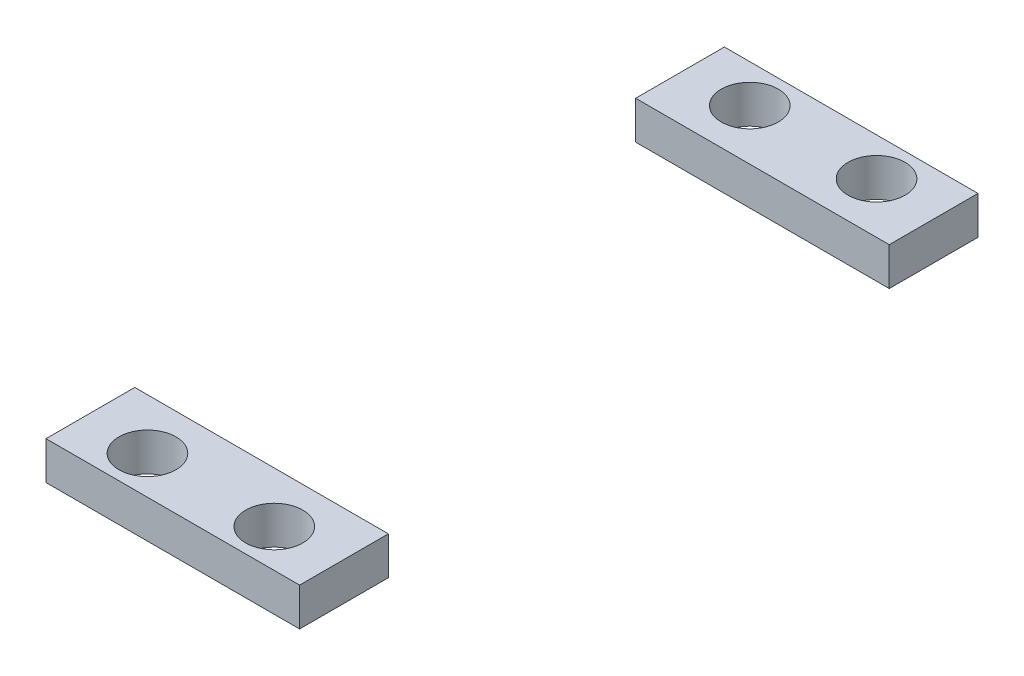
ISO-10303-21;
HEADER;
FILE_DESCRIPTION(('STEP AP214'),'2;1');
FILE_NAME('part.step','',(''),(''),'','','');
FILE_SCHEMA(('AUTOMOTIVE_DESIGN { 1 0 10303 214 1 1 1 1 }'));
ENDSEC;
DATA;
#1=APPLICATION_CONTEXT('core data for automotive mechanical design processes');
#2=APPLICATION_PROTOCOL_DEFINITION('international standard','automotive_design',2000,#1);
#3=PRODUCT_CONTEXT('',#1,'mechanical');
#4=PRODUCT('Part','Part','',(#3));
#5=PRODUCT_RELATED_PRODUCT_CATEGORY('part','',(#4));
#6=PRODUCT_DEFINITION_FORMATION('','',#4);
#7=PRODUCT_DEFINITION_CONTEXT('part definition',#1,'design');
#8=PRODUCT_DEFINITION('design','',#6,#7);
#9=PRODUCT_DEFINITION_SHAPE('','',#8);
#10=(LENGTH_UNIT() NAMED_UNIT(*) SI_UNIT(.MILLI.,.METRE.));
#11=(NAMED_UNIT(*) PLANE_ANGLE_UNIT() SI_UNIT($,.RADIAN.));
#12=(NAMED_UNIT(*) SI_UNIT($,.STERADIAN.) SOLID_ANGLE_UNIT());
#13=UNCERTAINTY_MEASURE_WITH_UNIT(LENGTH_MEASURE(1.E-05),#10,'distance_accuracy_value','');
#14=(GEOMETRIC_REPRESENTATION_CONTEXT(3) GLOBAL_UNCERTAINTY_ASSIGNED_CONTEXT((#13)) GLOBAL_UNIT_ASSIGNED_CONTEXT((#10,
#11,#12)) REPRESENTATION_CONTEXT('',''));
#15=CARTESIAN_POINT('',(0.,0.,0.));
#16=DIRECTION('',(0.,0.,1.));
#17=DIRECTION('',(1.,0.,0.));
#18=AXIS2_PLACEMENT_3D('',#15,#16,#17);
#19=CARTESIAN_POINT('',(0.,3.,-46.5));
#20=DIRECTION('',(0.,0.,-1.));
#21=DIRECTION('',(-1.,0.,0.));
#22=AXIS2_PLACEMENT_3D('',#19,#20,#21);
#23=PLANE('',#22);
#24=DIRECTION('',(1.,0.,0.));
#25=VECTOR('',#24,1.);
#26=CARTESIAN_POINT('',(0.,0.,-46.5));
#27=LINE('',#26,#25);
#28=CARTESIAN_POINT('',(0.,0.,-46.5));
#29=VERTEX_POINT('',#28);
#30=CARTESIAN_POINT('',(20.,0.,-46.5));
#31=VERTEX_POINT('',#30);
#32=EDGE_CURVE('E130',#29,#31,#27,.T.);
#33=ORIENTED_EDGE('',*,*,#32,.T.);
#34=DIRECTION('',(0.,-1.,0.));
#35=VECTOR('',#34,1.);
#36=CARTESIAN_POINT('',(20.,3.,-46.5));
#37=LINE('',#36,#35);
#38=CARTESIAN_POINT('',(20.,3.,-46.5));
#39=VERTEX_POINT('',#38);
#40=EDGE_CURVE('E14',#39,#31,#37,.T.);
#41=ORIENTED_EDGE('',*,*,#40,.F.);
#42=DIRECTION('',(1.,0.,0.));
#43=VECTOR('',#42,1.);
#44=CARTESIAN_POINT('',(0.,3.,-46.5));
#45=LINE('',#44,#43);
#46=CARTESIAN_POINT('',(0.,3.,-46.5));
#47=VERTEX_POINT('',#46);
#48=EDGE_CURVE('E110',#47,#39,#45,.T.);
#49=ORIENTED_EDGE('',*,*,#48,.F.);
#50=DIRECTION('',(0.,-1.,0.));
#51=VECTOR('',#50,1.);
#52=CARTESIAN_POINT('',(0.,3.,-46.5));
#53=LINE('',#52,#51);
#54=EDGE_CURVE('E77',#47,#29,#53,.T.);
#55=ORIENTED_EDGE('',*,*,#54,.T.);
#56=EDGE_LOOP('',(#33,#41,#49,#55));
#57=FACE_BOUND('',#56,.T.);
#58=ADVANCED_FACE('F60',(#57),#23,.F.);
#59=CARTESIAN_POINT('',(20.,3.,0.));
#60=DIRECTION('',(-1.,0.,0.));
#61=DIRECTION('',(0.,0.,1.));
#62=AXIS2_PLACEMENT_3D('',#59,#60,#61);
#63=PLANE('',#62);
#64=DIRECTION('',(0.,0.,-1.));
#65=VECTOR('',#64,1.);
#66=CARTESIAN_POINT('',(20.,0.,0.));
#67=LINE('',#66,#65);
#68=CARTESIAN_POINT('',(20.,0.,-53.5));
#69=VERTEX_POINT('',#68);
#70=EDGE_CURVE('E115',#31,#69,#67,.T.);
#71=ORIENTED_EDGE('',*,*,#70,.T.);
#72=DIRECTION('',(0.,-1.,0.));
#73=VECTOR('',#72,1.);
#74=CARTESIAN_POINT('',(20.,3.,-53.5));
#75=LINE('',#74,#73);
#76=CARTESIAN_POINT('',(20.,3.,-53.5));
#77=VERTEX_POINT('',#76);
#78=EDGE_CURVE('E69',#77,#69,#75,.T.);
#79=ORIENTED_EDGE('',*,*,#78,.F.);
#80=DIRECTION('',(0.,0.,-1.));
#81=VECTOR('',#80,1.);
#82=CARTESIAN_POINT('',(20.,3.,0.));
#83=LINE('',#82,#81);
#84=EDGE_CURVE('E102',#39,#77,#83,.T.);
#85=ORIENTED_EDGE('',*,*,#84,.F.);
#86=ORIENTED_EDGE('',*,*,#40,.T.);
#87=EDGE_LOOP('',(#71,#79,#85,#86));
#88=FACE_BOUND('',#87,.T.);
#89=ADVANCED_FACE('F114',(#88),#63,.F.);
#90=CARTESIAN_POINT('',(0.,3.,-53.5));
#91=DIRECTION('',(0.,0.,-1.));
#92=DIRECTION('',(-1.,0.,0.));
#93=AXIS2_PLACEMENT_3D('',#90,#91,#92);
#94=PLANE('',#93);
#95=DIRECTION('',(1.,0.,0.));
#96=VECTOR('',#95,1.);
#97=CARTESIAN_POINT('',(0.,0.,-53.5));
#98=LINE('',#97,#96);
#99=CARTESIAN_POINT('',(0.,0.,-53.5));
#100=VERTEX_POINT('',#99);
#101=EDGE_CURVE('E133',#100,#69,#98,.T.);
#102=ORIENTED_EDGE('',*,*,#101,.F.);
#103=DIRECTION('',(0.,-1.,0.));
#104=VECTOR('',#103,1.);
#105=CARTESIAN_POINT('',(0.,3.,-53.5));
#106=LINE('',#105,#104);
#107=CARTESIAN_POINT('',(0.,3.,-53.5));
#108=VERTEX_POINT('',#107);
#109=EDGE_CURVE('E91',#108,#100,#106,.T.);
#110=ORIENTED_EDGE('',*,*,#109,.F.);
#111=DIRECTION('',(1.,0.,0.));
#112=VECTOR('',#111,1.);
#113=CARTESIAN_POINT('',(0.,3.,-53.5));
#114=LINE('',#113,#112);
#115=EDGE_CURVE('E109',#108,#77,#114,.T.);
#116=ORIENTED_EDGE('',*,*,#115,.T.);
#117=ORIENTED_EDGE('',*,*,#78,.T.);
#118=EDGE_LOOP('',(#102,#110,#116,#117));
#119=FACE_BOUND('',#118,.T.);
#120=ADVANCED_FACE('F118',(#119),#94,.T.);
#121=CARTESIAN_POINT('',(15.,3.,-50.5));
#122=DIRECTION('',(0.,-1.,0.));
#123=DIRECTION('',(0.,0.,-1.));
#124=AXIS2_PLACEMENT_3D('',#121,#122,#123);
#125=CYLINDRICAL_SURFACE('',#124,2.25);
#126=CARTESIAN_POINT('',(15.,3.,-50.5));
#127=DIRECTION('',(0.,1.,0.));
#128=DIRECTION('',(0.,0.,1.));
#129=AXIS2_PLACEMENT_3D('',#126,#127,#128);
#130=CIRCLE('',#129,2.25);
#131=CARTESIAN_POINT('',(15.,3.,-48.25));
#132=VERTEX_POINT('',#131);
#133=EDGE_CURVE('E142',#132,#132,#130,.T.);
#134=ORIENTED_EDGE('',*,*,#133,.T.);
#135=EDGE_LOOP('',(#134));
#136=FACE_BOUND('',#135,.T.);
#137=CARTESIAN_POINT('',(15.,0.,-50.5));
#138=DIRECTION('',(0.,1.,0.));
#139=DIRECTION('',(0.,0.,1.));
#140=AXIS2_PLACEMENT_3D('',#137,#138,#139);
#141=CIRCLE('',#140,2.25);
#142=CARTESIAN_POINT('',(15.,0.,-48.25));
#143=VERTEX_POINT('',#142);
#144=EDGE_CURVE('E127',#143,#143,#141,.T.);
#145=ORIENTED_EDGE('',*,*,#144,.F.);
#146=EDGE_LOOP('',(#145));
#147=FACE_BOUND('',#146,.T.);
#148=ADVANCED_FACE('F150',(#136,#147),#125,.F.);
#149=CARTESIAN_POINT('',(5.,3.,-50.5));
#150=DIRECTION('',(0.,-1.,0.));
#151=DIRECTION('',(0.,0.,-1.));
#152=AXIS2_PLACEMENT_3D('',#149,#150,#151);
#153=CYLINDRICAL_SURFACE('',#152,2.25);
#154=CARTESIAN_POINT('',(5.,3.,-50.5));
#155=DIRECTION('',(0.,1.,0.));
#156=DIRECTION('',(0.,0.,1.));
#157=AXIS2_PLACEMENT_3D('',#154,#155,#156);
#158=CIRCLE('',#157,2.25);
#159=CARTESIAN_POINT('',(5.,3.,-48.25));
#160=VERTEX_POINT('',#159);
#161=EDGE_CURVE('E138',#160,#160,#158,.T.);
#162=ORIENTED_EDGE('',*,*,#161,.T.);
#163=EDGE_LOOP('',(#162));
#164=FACE_BOUND('',#163,.T.);
#165=CARTESIAN_POINT('',(5.,0.,-50.5));
#166=DIRECTION('',(0.,1.,0.));
#167=DIRECTION('',(0.,0.,1.));
#168=AXIS2_PLACEMENT_3D('',#165,#166,#167);
#169=CIRCLE('',#168,2.25);
#170=CARTESIAN_POINT('',(5.,0.,-48.25));
#171=VERTEX_POINT('',#170);
#172=EDGE_CURVE('E124',#171,#171,#169,.T.);
#173=ORIENTED_EDGE('',*,*,#172,.F.);
#174=EDGE_LOOP('',(#173));
#175=FACE_BOUND('',#174,.T.);
#176=ADVANCED_FACE('F62',(#164,#175),#153,.F.);
#177=CARTESIAN_POINT('',(0.,3.,0.));
#178=DIRECTION('',(-1.,0.,0.));
#179=DIRECTION('',(0.,0.,1.));
#180=AXIS2_PLACEMENT_3D('',#177,#178,#179);
#181=PLANE('',#180);
#182=DIRECTION('',(0.,0.,-1.));
#183=VECTOR('',#182,1.);
#184=CARTESIAN_POINT('',(0.,0.,0.));
#185=LINE('',#184,#183);
#186=EDGE_CURVE('E135',#29,#100,#185,.T.);
#187=ORIENTED_EDGE('',*,*,#186,.F.);
#188=ORIENTED_EDGE('',*,*,#54,.F.);
#189=DIRECTION('',(0.,0.,-1.));
#190=VECTOR('',#189,1.);
#191=CARTESIAN_POINT('',(0.,3.,0.));
#192=LINE('',#191,#190);
#193=EDGE_CURVE('E119',#47,#108,#192,.T.);
#194=ORIENTED_EDGE('',*,*,#193,.T.);
#195=ORIENTED_EDGE('',*,*,#109,.T.);
#196=EDGE_LOOP('',(#187,#188,#194,#195));
#197=FACE_BOUND('',#196,.T.);
#198=ADVANCED_FACE('F155',(#197),#181,.T.);
#199=CARTESIAN_POINT('',(0.,3.,0.));
#200=DIRECTION('',(0.,1.,0.));
#201=DIRECTION('',(0.,0.,1.));
#202=AXIS2_PLACEMENT_3D('',#199,#200,#201);
#203=PLANE('',#202);
#204=ORIENTED_EDGE('',*,*,#161,.F.);
#205=EDGE_LOOP('',(#204));
#206=FACE_BOUND('',#205,.T.);
#207=ORIENTED_EDGE('',*,*,#133,.F.);
#208=EDGE_LOOP('',(#207));
#209=FACE_BOUND('',#208,.T.);
#210=ORIENTED_EDGE('',*,*,#48,.T.);
#211=ORIENTED_EDGE('',*,*,#84,.T.);
#212=ORIENTED_EDGE('',*,*,#115,.F.);
#213=ORIENTED_EDGE('',*,*,#193,.F.);
#214=EDGE_LOOP('',(#210,#211,#212,#213));
#215=FACE_BOUND('',#214,.T.);
#216=ADVANCED_FACE('F106',(#206,#209,#215),#203,.T.);
#217=CARTESIAN_POINT('',(0.,0.,0.));
#218=DIRECTION('',(0.,1.,0.));
#219=DIRECTION('',(0.,0.,1.));
#220=AXIS2_PLACEMENT_3D('',#217,#218,#219);
#221=PLANE('',#220);
#222=ORIENTED_EDGE('',*,*,#172,.T.);
#223=EDGE_LOOP('',(#222));
#224=FACE_BOUND('',#223,.T.);
#225=ORIENTED_EDGE('',*,*,#144,.T.);
#226=EDGE_LOOP('',(#225));
#227=FACE_BOUND('',#226,.T.);
#228=ORIENTED_EDGE('',*,*,#32,.F.);
#229=ORIENTED_EDGE('',*,*,#186,.T.);
#230=ORIENTED_EDGE('',*,*,#101,.T.);
#231=ORIENTED_EDGE('',*,*,#70,.F.);
#232=EDGE_LOOP('',(#228,#229,#230,#231));
#233=FACE_BOUND('',#232,.T.);
#234=ADVANCED_FACE('F154',(#224,#227,#233),#221,.F.);
#235=CLOSED_SHELL('',(#58,#89,#120,#148,#176,#198,#216,#234));
#236=MANIFOLD_SOLID_BREP('B2',#235);
#237=CARTESIAN_POINT('',(0.,3.,-7.));
#238=DIRECTION('',(0.,0.,-1.));
#239=DIRECTION('',(-1.,0.,0.));
#240=AXIS2_PLACEMENT_3D('',#237,#238,#239);
#241=PLANE('',#240);
#242=DIRECTION('',(1.,0.,0.));
#243=VECTOR('',#242,1.);
#244=CARTESIAN_POINT('',(0.,0.,-7.));
#245=LINE('',#244,#243);
#246=CARTESIAN_POINT('',(0.,0.,-7.));
#247=VERTEX_POINT('',#246);
#248=CARTESIAN_POINT('',(20.,0.,-7.));
#249=VERTEX_POINT('',#248);
#250=EDGE_CURVE('E315',#247,#249,#245,.T.);
#251=ORIENTED_EDGE('',*,*,#250,.F.);
#252=DIRECTION('',(0.,-1.,0.));
#253=VECTOR('',#252,1.);
#254=CARTESIAN_POINT('',(0.,3.,-7.));
#255=LINE('',#254,#253);
#256=CARTESIAN_POINT('',(0.,3.,-7.));
#257=VERTEX_POINT('',#256);
#258=EDGE_CURVE('E58',#257,#247,#255,.T.);
#259=ORIENTED_EDGE('',*,*,#258,.F.);
#260=DIRECTION('',(1.,0.,0.));
#261=VECTOR('',#260,1.);
#262=CARTESIAN_POINT('',(0.,3.,-7.));
#263=LINE('',#262,#261);
#264=CARTESIAN_POINT('',(20.,3.,-7.));
#265=VERTEX_POINT('',#264);
#266=EDGE_CURVE('E302',#257,#265,#263,.T.);
#267=ORIENTED_EDGE('',*,*,#266,.T.);
#268=DIRECTION('',(0.,-1.,0.));
#269=VECTOR('',#268,1.);
#270=CARTESIAN_POINT('',(20.,3.,-7.));
#271=LINE('',#270,#269);
#272=EDGE_CURVE('E281',#265,#249,#271,.T.);
#273=ORIENTED_EDGE('',*,*,#272,.T.);
#274=EDGE_LOOP('',(#251,#259,#267,#273));
#275=FACE_BOUND('',#274,.T.);
#276=ADVANCED_FACE('F241',(#275),#241,.T.);
#277=CARTESIAN_POINT('',(0.,3.,0.));
#278=DIRECTION('',(-1.,0.,0.));
#279=DIRECTION('',(0.,0.,1.));
#280=AXIS2_PLACEMENT_3D('',#277,#278,#279);
#281=PLANE('',#280);
#282=DIRECTION('',(0.,0.,-1.));
#283=VECTOR('',#282,1.);
#284=CARTESIAN_POINT('',(0.,0.,0.));
#285=LINE('',#284,#283);
#286=CARTESIAN_POINT('',(0.,0.,0.));
#287=VERTEX_POINT('',#286);
#288=EDGE_CURVE('E293',#287,#247,#285,.T.);
#289=ORIENTED_EDGE('',*,*,#288,.F.);
#290=DIRECTION('',(0.,-1.,0.));
#291=VECTOR('',#290,1.);
#292=CARTESIAN_POINT('',(0.,3.,0.));
#293=LINE('',#292,#291);
#294=CARTESIAN_POINT('',(0.,3.,0.));
#295=VERTEX_POINT('',#294);
#296=EDGE_CURVE('E250',#295,#287,#293,.T.);
#297=ORIENTED_EDGE('',*,*,#296,.F.);
#298=DIRECTION('',(0.,0.,-1.));
#299=VECTOR('',#298,1.);
#300=CARTESIAN_POINT('',(0.,3.,0.));
#301=LINE('',#300,#299);
#302=EDGE_CURVE('E291',#295,#257,#301,.T.);
#303=ORIENTED_EDGE('',*,*,#302,.T.);
#304=ORIENTED_EDGE('',*,*,#258,.T.);
#305=EDGE_LOOP('',(#289,#297,#303,#304));
#306=FACE_BOUND('',#305,.T.);
#307=ADVANCED_FACE('F289',(#306),#281,.T.);
#308=CARTESIAN_POINT('',(0.,3.,0.));
#309=DIRECTION('',(0.,0.,-1.));
#310=DIRECTION('',(-1.,0.,0.));
#311=AXIS2_PLACEMENT_3D('',#308,#309,#310);
#312=PLANE('',#311);
#313=DIRECTION('',(1.,0.,0.));
#314=VECTOR('',#313,1.);
#315=CARTESIAN_POINT('',(0.,0.,0.));
#316=LINE('',#315,#314);
#317=CARTESIAN_POINT('',(20.,0.,0.));
#318=VERTEX_POINT('',#317);
#319=EDGE_CURVE('E318',#287,#318,#316,.T.);
#320=ORIENTED_EDGE('',*,*,#319,.T.);
#321=DIRECTION('',(0.,-1.,0.));
#322=VECTOR('',#321,1.);
#323=CARTESIAN_POINT('',(20.,3.,0.));
#324=LINE('',#323,#322);
#325=CARTESIAN_POINT('',(20.,3.,0.));
#326=VERTEX_POINT('',#325);
#327=EDGE_CURVE('E296',#326,#318,#324,.T.);
#328=ORIENTED_EDGE('',*,*,#327,.F.);
#329=DIRECTION('',(1.,0.,0.));
#330=VECTOR('',#329,1.);
#331=CARTESIAN_POINT('',(0.,3.,0.));
#332=LINE('',#331,#330);
#333=EDGE_CURVE('E298',#295,#326,#332,.T.);
#334=ORIENTED_EDGE('',*,*,#333,.F.);
#335=ORIENTED_EDGE('',*,*,#296,.T.);
#336=EDGE_LOOP('',(#320,#328,#334,#335));
#337=FACE_BOUND('',#336,.T.);
#338=ADVANCED_FACE('F299',(#337),#312,.F.);
#339=CARTESIAN_POINT('',(5.,3.,-3.));
#340=DIRECTION('',(0.,-1.,0.));
#341=DIRECTION('',(0.,0.,-1.));
#342=AXIS2_PLACEMENT_3D('',#339,#340,#341);
#343=CYLINDRICAL_SURFACE('',#342,2.25);
#344=CARTESIAN_POINT('',(5.,3.,-3.));
#345=DIRECTION('',(0.,1.,0.));
#346=DIRECTION('',(0.,0.,1.));
#347=AXIS2_PLACEMENT_3D('',#344,#345,#346);
#348=CIRCLE('',#347,2.25);
#349=CARTESIAN_POINT('',(5.,3.,-0.75));
#350=VERTEX_POINT('',#349);
#351=EDGE_CURVE('E304',#350,#350,#348,.T.);
#352=ORIENTED_EDGE('',*,*,#351,.T.);
#353=EDGE_LOOP('',(#352));
#354=FACE_BOUND('',#353,.T.);
#355=CARTESIAN_POINT('',(5.,0.,-3.));
#356=DIRECTION('',(0.,1.,0.));
#357=DIRECTION('',(0.,0.,1.));
#358=AXIS2_PLACEMENT_3D('',#355,#356,#357);
#359=CIRCLE('',#358,2.25);
#360=CARTESIAN_POINT('',(5.,0.,-0.75));
#361=VERTEX_POINT('',#360);
#362=EDGE_CURVE('E312',#361,#361,#359,.T.);
#363=ORIENTED_EDGE('',*,*,#362,.F.);
#364=EDGE_LOOP('',(#363));
#365=FACE_BOUND('',#364,.T.);
#366=ADVANCED_FACE('F333',(#354,#365),#343,.F.);
#367=CARTESIAN_POINT('',(15.,3.,-3.));
#368=DIRECTION('',(0.,-1.,0.));
#369=DIRECTION('',(0.,0.,-1.));
#370=AXIS2_PLACEMENT_3D('',#367,#368,#369);
#371=CYLINDRICAL_SURFACE('',#370,2.25);
#372=CARTESIAN_POINT('',(15.,3.,-3.));
#373=DIRECTION('',(0.,1.,0.));
#374=DIRECTION('',(0.,0.,1.));
#375=AXIS2_PLACEMENT_3D('',#372,#373,#374);
#376=CIRCLE('',#375,2.25);
#377=CARTESIAN_POINT('',(15.,3.,-0.750000000000001));
#378=VERTEX_POINT('',#377);
#379=EDGE_CURVE('E321',#378,#378,#376,.T.);
#380=ORIENTED_EDGE('',*,*,#379,.T.);
#381=EDGE_LOOP('',(#380));
#382=FACE_BOUND('',#381,.T.);
#383=CARTESIAN_POINT('',(15.,0.,-3.));
#384=DIRECTION('',(0.,1.,0.));
#385=DIRECTION('',(0.,0.,1.));
#386=AXIS2_PLACEMENT_3D('',#383,#384,#385);
#387=CIRCLE('',#386,2.25);
#388=CARTESIAN_POINT('',(15.,0.,-0.750000000000001));
#389=VERTEX_POINT('',#388);
#390=EDGE_CURVE('E309',#389,#389,#387,.T.);
#391=ORIENTED_EDGE('',*,*,#390,.F.);
#392=EDGE_LOOP('',(#391));
#393=FACE_BOUND('',#392,.T.);
#394=ADVANCED_FACE('F243',(#382,#393),#371,.F.);
#395=CARTESIAN_POINT('',(20.,3.,0.));
#396=DIRECTION('',(-1.,0.,0.));
#397=DIRECTION('',(0.,0.,1.));
#398=AXIS2_PLACEMENT_3D('',#395,#396,#397);
#399=PLANE('',#398);
#400=DIRECTION('',(0.,0.,-1.));
#401=VECTOR('',#400,1.);
#402=CARTESIAN_POINT('',(20.,0.,0.));
#403=LINE('',#402,#401);
#404=EDGE_CURVE('E274',#318,#249,#403,.T.);
#405=ORIENTED_EDGE('',*,*,#404,.T.);
#406=ORIENTED_EDGE('',*,*,#272,.F.);
#407=DIRECTION('',(0.,0.,-1.));
#408=VECTOR('',#407,1.);
#409=CARTESIAN_POINT('',(20.,3.,0.));
#410=LINE('',#409,#408);
#411=EDGE_CURVE('E258',#326,#265,#410,.T.);
#412=ORIENTED_EDGE('',*,*,#411,.F.);
#413=ORIENTED_EDGE('',*,*,#327,.T.);
#414=EDGE_LOOP('',(#405,#406,#412,#413));
#415=FACE_BOUND('',#414,.T.);
#416=ADVANCED_FACE('F324',(#415),#399,.F.);
#417=CARTESIAN_POINT('',(0.,3.,0.));
#418=DIRECTION('',(0.,1.,0.));
#419=DIRECTION('',(0.,0.,1.));
#420=AXIS2_PLACEMENT_3D('',#417,#418,#419);
#421=PLANE('',#420);
#422=ORIENTED_EDGE('',*,*,#379,.F.);
#423=EDGE_LOOP('',(#422));
#424=FACE_BOUND('',#423,.T.);
#425=ORIENTED_EDGE('',*,*,#351,.F.);
#426=EDGE_LOOP('',(#425));
#427=FACE_BOUND('',#426,.T.);
#428=ORIENTED_EDGE('',*,*,#266,.F.);
#429=ORIENTED_EDGE('',*,*,#302,.F.);
#430=ORIENTED_EDGE('',*,*,#333,.T.);
#431=ORIENTED_EDGE('',*,*,#411,.T.);
#432=EDGE_LOOP('',(#428,#429,#430,#431));
#433=FACE_BOUND('',#432,.T.);
#434=ADVANCED_FACE('F301',(#424,#427,#433),#421,.T.);
#435=CARTESIAN_POINT('',(0.,0.,0.));
#436=DIRECTION('',(0.,1.,0.));
#437=DIRECTION('',(0.,0.,1.));
#438=AXIS2_PLACEMENT_3D('',#435,#436,#437);
#439=PLANE('',#438);
#440=ORIENTED_EDGE('',*,*,#390,.T.);
#441=EDGE_LOOP('',(#440));
#442=FACE_BOUND('',#441,.T.);
#443=ORIENTED_EDGE('',*,*,#362,.T.);
#444=EDGE_LOOP('',(#443));
#445=FACE_BOUND('',#444,.T.);
#446=ORIENTED_EDGE('',*,*,#250,.T.);
#447=ORIENTED_EDGE('',*,*,#404,.F.);
#448=ORIENTED_EDGE('',*,*,#319,.F.);
#449=ORIENTED_EDGE('',*,*,#288,.T.);
#450=EDGE_LOOP('',(#446,#447,#448,#449));
#451=FACE_BOUND('',#450,.T.);
#452=ADVANCED_FACE('F325',(#442,#445,#451),#439,.F.);
#453=CLOSED_SHELL('',(#276,#307,#338,#366,#394,#416,#434,#452));
#454=MANIFOLD_SOLID_BREP('B8',#453);
#455=ADVANCED_BREP_SHAPE_REPRESENTATION('',(#18,#236,#454),#14);
#456=SHAPE_DEFINITION_REPRESENTATION(#9,#455);
ENDSEC;
END-ISO-10303-21;
